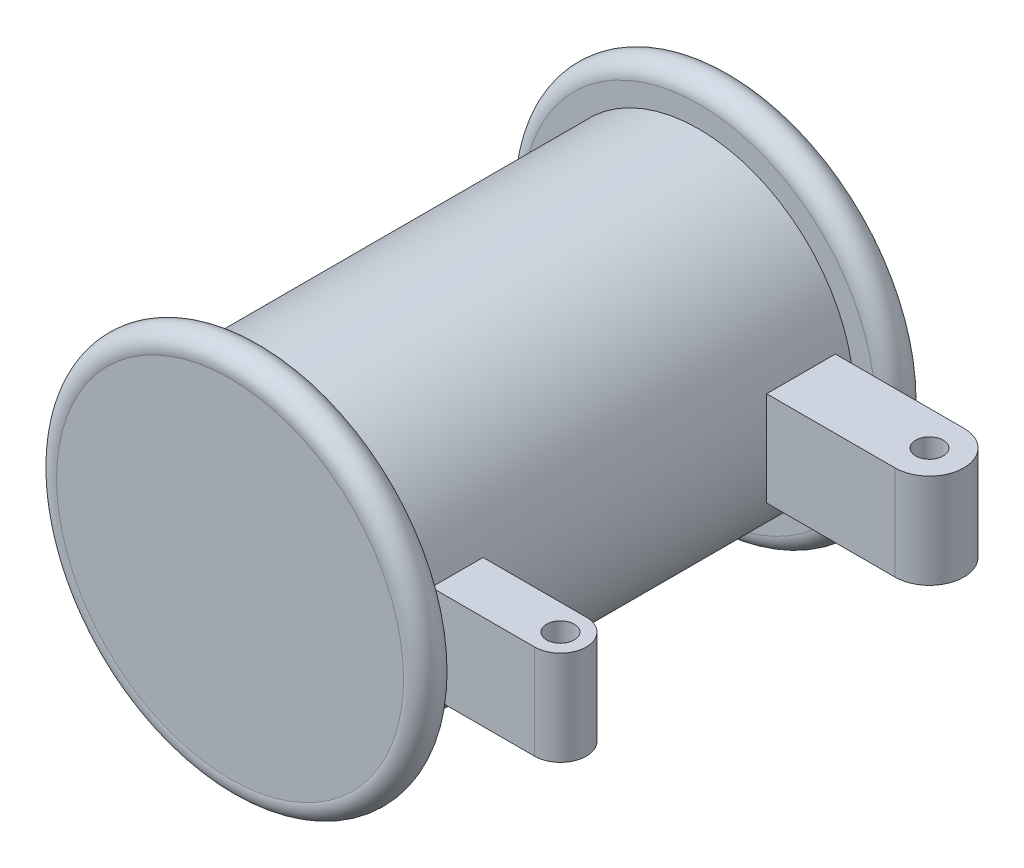
ISO-10303-21;
HEADER;
FILE_DESCRIPTION(('STEP AP214'),'2;1');
FILE_NAME('part.step','',(''),(''),'','','');
FILE_SCHEMA(('AUTOMOTIVE_DESIGN { 1 0 10303 214 1 1 1 1 }'));
ENDSEC;
DATA;
#1=APPLICATION_CONTEXT('core data for automotive mechanical design processes');
#2=APPLICATION_PROTOCOL_DEFINITION('international standard','automotive_design',2000,#1);
#3=PRODUCT_CONTEXT('',#1,'mechanical');
#4=PRODUCT('Part','Part','',(#3));
#5=PRODUCT_RELATED_PRODUCT_CATEGORY('part','',(#4));
#6=PRODUCT_DEFINITION_FORMATION('','',#4);
#7=PRODUCT_DEFINITION_CONTEXT('part definition',#1,'design');
#8=PRODUCT_DEFINITION('design','',#6,#7);
#9=PRODUCT_DEFINITION_SHAPE('','',#8);
#10=(LENGTH_UNIT() NAMED_UNIT(*) SI_UNIT(.MILLI.,.METRE.));
#11=(NAMED_UNIT(*) PLANE_ANGLE_UNIT() SI_UNIT($,.RADIAN.));
#12=(NAMED_UNIT(*) SI_UNIT($,.STERADIAN.) SOLID_ANGLE_UNIT());
#13=UNCERTAINTY_MEASURE_WITH_UNIT(LENGTH_MEASURE(1.E-05),#10,'distance_accuracy_value','');
#14=(GEOMETRIC_REPRESENTATION_CONTEXT(3) GLOBAL_UNCERTAINTY_ASSIGNED_CONTEXT((#13)) GLOBAL_UNIT_ASSIGNED_CONTEXT((#10,
#11,#12)) REPRESENTATION_CONTEXT('',''));
#15=CARTESIAN_POINT('',(0.,0.,0.));
#16=DIRECTION('',(0.,0.,1.));
#17=DIRECTION('',(1.,0.,0.));
#18=AXIS2_PLACEMENT_3D('',#15,#16,#17);
#19=CARTESIAN_POINT('',(5.313,0.344,-3.022));
#20=DIRECTION('',(0.,-1.,0.));
#21=DIRECTION('',(0.,0.,-1.));
#22=AXIS2_PLACEMENT_3D('',#19,#20,#21);
#23=CYLINDRICAL_SURFACE('',#22,0.25);
#24=CARTESIAN_POINT('',(5.313,-0.344,-3.022));
#25=DIRECTION('',(0.,1.,0.));
#26=DIRECTION('',(0.,0.,1.));
#27=AXIS2_PLACEMENT_3D('',#24,#25,#26);
#28=CIRCLE('',#27,0.25);
#29=CARTESIAN_POINT('',(5.313,-0.344,-3.272));
#30=VERTEX_POINT('',#29);
#31=CARTESIAN_POINT('',(5.313,-0.344,-2.772));
#32=VERTEX_POINT('',#31);
#33=EDGE_CURVE('E125',#30,#32,#28,.F.);
#34=ORIENTED_EDGE('',*,*,#33,.F.);
#35=DIRECTION('',(0.,-1.,0.));
#36=VECTOR('',#35,1.);
#37=CARTESIAN_POINT('',(5.313,0.344,-3.272));
#38=LINE('',#37,#36);
#39=CARTESIAN_POINT('',(5.313,0.344,-3.272));
#40=VERTEX_POINT('',#39);
#41=EDGE_CURVE('E12',#40,#30,#38,.T.);
#42=ORIENTED_EDGE('',*,*,#41,.F.);
#43=CARTESIAN_POINT('',(5.313,0.344,-3.022));
#44=DIRECTION('',(0.,1.,0.));
#45=DIRECTION('',(0.,0.,1.));
#46=AXIS2_PLACEMENT_3D('',#43,#44,#45);
#47=CIRCLE('',#46,0.25);
#48=CARTESIAN_POINT('',(5.313,0.344,-2.772));
#49=VERTEX_POINT('',#48);
#50=EDGE_CURVE('E115',#40,#49,#47,.F.);
#51=ORIENTED_EDGE('',*,*,#50,.T.);
#52=DIRECTION('',(0.,-1.,0.));
#53=VECTOR('',#52,1.);
#54=CARTESIAN_POINT('',(5.313,0.344,-2.772));
#55=LINE('',#54,#53);
#56=EDGE_CURVE('E73',#49,#32,#55,.T.);
#57=ORIENTED_EDGE('',*,*,#56,.T.);
#58=EDGE_LOOP('',(#34,#42,#51,#57));
#59=FACE_BOUND('',#58,.T.);
#60=ADVANCED_FACE('F56',(#59),#23,.T.);
#61=CARTESIAN_POINT('',(0.,0.344,-3.27199999999999));
#62=DIRECTION('',(0.,0.,-1.));
#63=DIRECTION('',(-1.,0.,0.));
#64=AXIS2_PLACEMENT_3D('',#61,#62,#63);
#65=PLANE('',#64);
#66=DIRECTION('',(1.,0.,0.));
#67=VECTOR('',#66,1.);
#68=CARTESIAN_POINT('',(0.,-0.344,-3.27199999999999));
#69=LINE('',#68,#67);
#70=CARTESIAN_POINT('',(4.379,-0.344,-3.272));
#71=VERTEX_POINT('',#70);
#72=EDGE_CURVE('E105',#71,#30,#69,.T.);
#73=ORIENTED_EDGE('',*,*,#72,.F.);
#74=DIRECTION('',(0.,-1.,0.));
#75=VECTOR('',#74,1.);
#76=CARTESIAN_POINT('',(4.379,0.344,-3.272));
#77=LINE('',#76,#75);
#78=CARTESIAN_POINT('',(4.379,0.344,-3.272));
#79=VERTEX_POINT('',#78);
#80=EDGE_CURVE('E65',#79,#71,#77,.T.);
#81=ORIENTED_EDGE('',*,*,#80,.F.);
#82=DIRECTION('',(1.,0.,0.));
#83=VECTOR('',#82,1.);
#84=CARTESIAN_POINT('',(0.,0.344,-3.27199999999999));
#85=LINE('',#84,#83);
#86=EDGE_CURVE('E103',#79,#40,#85,.T.);
#87=ORIENTED_EDGE('',*,*,#86,.T.);
#88=ORIENTED_EDGE('',*,*,#41,.T.);
#89=EDGE_LOOP('',(#73,#81,#87,#88));
#90=FACE_BOUND('',#89,.T.);
#91=ADVANCED_FACE('F101',(#90),#65,.T.);
#92=CARTESIAN_POINT('',(4.379,0.344,0.));
#93=DIRECTION('',(1.,0.,0.));
#94=DIRECTION('',(0.,0.,-1.));
#95=AXIS2_PLACEMENT_3D('',#92,#93,#94);
#96=PLANE('',#95);
#97=DIRECTION('',(0.,0.,1.));
#98=VECTOR('',#97,1.);
#99=CARTESIAN_POINT('',(4.379,-0.344,0.));
#100=LINE('',#99,#98);
#101=CARTESIAN_POINT('',(4.379,-0.344,-2.772));
#102=VERTEX_POINT('',#101);
#103=EDGE_CURVE('E128',#71,#102,#100,.T.);
#104=ORIENTED_EDGE('',*,*,#103,.T.);
#105=DIRECTION('',(0.,-1.,0.));
#106=VECTOR('',#105,1.);
#107=CARTESIAN_POINT('',(4.379,0.344,-2.772));
#108=LINE('',#107,#106);
#109=CARTESIAN_POINT('',(4.379,0.344,-2.772));
#110=VERTEX_POINT('',#109);
#111=EDGE_CURVE('E87',#110,#102,#108,.T.);
#112=ORIENTED_EDGE('',*,*,#111,.F.);
#113=DIRECTION('',(0.,0.,1.));
#114=VECTOR('',#113,1.);
#115=CARTESIAN_POINT('',(4.379,0.344,0.));
#116=LINE('',#115,#114);
#117=EDGE_CURVE('E108',#79,#110,#116,.T.);
#118=ORIENTED_EDGE('',*,*,#117,.F.);
#119=ORIENTED_EDGE('',*,*,#80,.T.);
#120=EDGE_LOOP('',(#104,#112,#118,#119));
#121=FACE_BOUND('',#120,.T.);
#122=ADVANCED_FACE('F109',(#121),#96,.F.);
#123=CARTESIAN_POINT('',(5.313,0.344,-3.022));
#124=DIRECTION('',(0.,-1.,0.));
#125=DIRECTION('',(0.,0.,-1.));
#126=AXIS2_PLACEMENT_3D('',#123,#124,#125);
#127=CYLINDRICAL_SURFACE('',#126,0.1);
#128=CARTESIAN_POINT('',(5.313,0.344,-3.022));
#129=DIRECTION('',(0.,1.,0.));
#130=DIRECTION('',(0.,0.,1.));
#131=AXIS2_PLACEMENT_3D('',#128,#129,#130);
#132=CIRCLE('',#131,0.1);
#133=CARTESIAN_POINT('',(5.313,0.344,-2.922));
#134=VERTEX_POINT('',#133);
#135=EDGE_CURVE('E117',#134,#134,#132,.T.);
#136=ORIENTED_EDGE('',*,*,#135,.T.);
#137=EDGE_LOOP('',(#136));
#138=FACE_BOUND('',#137,.T.);
#139=CARTESIAN_POINT('',(5.313,-0.344,-3.022));
#140=DIRECTION('',(0.,1.,0.));
#141=DIRECTION('',(0.,0.,1.));
#142=AXIS2_PLACEMENT_3D('',#139,#140,#141);
#143=CIRCLE('',#142,0.1);
#144=CARTESIAN_POINT('',(5.313,-0.344,-2.922));
#145=VERTEX_POINT('',#144);
#146=EDGE_CURVE('E122',#145,#145,#143,.T.);
#147=ORIENTED_EDGE('',*,*,#146,.F.);
#148=EDGE_LOOP('',(#147));
#149=FACE_BOUND('',#148,.T.);
#150=ADVANCED_FACE('F58',(#138,#149),#127,.F.);
#151=CARTESIAN_POINT('',(0.,0.344,-2.77199999999999));
#152=DIRECTION('',(0.,0.,1.));
#153=DIRECTION('',(1.,0.,0.));
#154=AXIS2_PLACEMENT_3D('',#151,#152,#153);
#155=PLANE('',#154);
#156=DIRECTION('',(-1.,0.,0.));
#157=VECTOR('',#156,1.);
#158=CARTESIAN_POINT('',(0.,-0.344,-2.77199999999999));
#159=LINE('',#158,#157);
#160=EDGE_CURVE('E130',#32,#102,#159,.T.);
#161=ORIENTED_EDGE('',*,*,#160,.F.);
#162=ORIENTED_EDGE('',*,*,#56,.F.);
#163=DIRECTION('',(-1.,0.,0.));
#164=VECTOR('',#163,1.);
#165=CARTESIAN_POINT('',(0.,0.344,-2.77199999999999));
#166=LINE('',#165,#164);
#167=EDGE_CURVE('E112',#49,#110,#166,.T.);
#168=ORIENTED_EDGE('',*,*,#167,.T.);
#169=ORIENTED_EDGE('',*,*,#111,.T.);
#170=EDGE_LOOP('',(#161,#162,#168,#169));
#171=FACE_BOUND('',#170,.T.);
#172=ADVANCED_FACE('F142',(#171),#155,.T.);
#173=CARTESIAN_POINT('',(0.,0.344,0.));
#174=DIRECTION('',(0.,1.,0.));
#175=DIRECTION('',(0.,0.,1.));
#176=AXIS2_PLACEMENT_3D('',#173,#174,#175);
#177=PLANE('',#176);
#178=ORIENTED_EDGE('',*,*,#135,.F.);
#179=EDGE_LOOP('',(#178));
#180=FACE_BOUND('',#179,.T.);
#181=ORIENTED_EDGE('',*,*,#50,.F.);
#182=ORIENTED_EDGE('',*,*,#86,.F.);
#183=ORIENTED_EDGE('',*,*,#117,.T.);
#184=ORIENTED_EDGE('',*,*,#167,.F.);
#185=EDGE_LOOP('',(#181,#182,#183,#184));
#186=FACE_BOUND('',#185,.T.);
#187=ADVANCED_FACE('F114',(#180,#186),#177,.T.);
#188=CARTESIAN_POINT('',(0.,-0.344,0.));
#189=DIRECTION('',(0.,1.,0.));
#190=DIRECTION('',(0.,0.,1.));
#191=AXIS2_PLACEMENT_3D('',#188,#189,#190);
#192=PLANE('',#191);
#193=ORIENTED_EDGE('',*,*,#146,.T.);
#194=EDGE_LOOP('',(#193));
#195=FACE_BOUND('',#194,.T.);
#196=ORIENTED_EDGE('',*,*,#33,.T.);
#197=ORIENTED_EDGE('',*,*,#160,.T.);
#198=ORIENTED_EDGE('',*,*,#103,.F.);
#199=ORIENTED_EDGE('',*,*,#72,.T.);
#200=EDGE_LOOP('',(#196,#197,#198,#199));
#201=FACE_BOUND('',#200,.T.);
#202=ADVANCED_FACE('F141',(#195,#201),#192,.F.);
#203=CLOSED_SHELL('',(#60,#91,#122,#150,#172,#187,#202));
#204=MANIFOLD_SOLID_BREP('B2',#203);
#205=CARTESIAN_POINT('',(5.13,0.344,-0.522000000000002));
#206=DIRECTION('',(0.,-1.,0.));
#207=DIRECTION('',(0.,0.,-1.));
#208=AXIS2_PLACEMENT_3D('',#205,#206,#207);
#209=CYLINDRICAL_SURFACE('',#208,0.188);
#210=CARTESIAN_POINT('',(5.13,-0.344,-0.522000000000002));
#211=DIRECTION('',(0.,1.,0.));
#212=DIRECTION('',(0.,0.,1.));
#213=AXIS2_PLACEMENT_3D('',#210,#211,#212);
#214=CIRCLE('',#213,0.188);
#215=CARTESIAN_POINT('',(5.13,-0.344,-0.710000000000002));
#216=VERTEX_POINT('',#215);
#217=CARTESIAN_POINT('',(5.13,-0.344,-0.334000000000002));
#218=VERTEX_POINT('',#217);
#219=EDGE_CURVE('E279',#216,#218,#214,.F.);
#220=ORIENTED_EDGE('',*,*,#219,.F.);
#221=DIRECTION('',(0.,-1.,0.));
#222=VECTOR('',#221,1.);
#223=CARTESIAN_POINT('',(5.13,0.344,-0.710000000000002));
#224=LINE('',#223,#222);
#225=CARTESIAN_POINT('',(5.13,0.344,-0.710000000000002));
#226=VERTEX_POINT('',#225);
#227=EDGE_CURVE('E54',#226,#216,#224,.T.);
#228=ORIENTED_EDGE('',*,*,#227,.F.);
#229=CARTESIAN_POINT('',(5.13,0.344,-0.522000000000002));
#230=DIRECTION('',(0.,1.,0.));
#231=DIRECTION('',(0.,0.,1.));
#232=AXIS2_PLACEMENT_3D('',#229,#230,#231);
#233=CIRCLE('',#232,0.188);
#234=CARTESIAN_POINT('',(5.13,0.344,-0.334000000000002));
#235=VERTEX_POINT('',#234);
#236=EDGE_CURVE('E269',#226,#235,#233,.F.);
#237=ORIENTED_EDGE('',*,*,#236,.T.);
#238=DIRECTION('',(0.,-1.,0.));
#239=VECTOR('',#238,1.);
#240=CARTESIAN_POINT('',(5.13,0.344,-0.334000000000002));
#241=LINE('',#240,#239);
#242=EDGE_CURVE('E227',#235,#218,#241,.T.);
#243=ORIENTED_EDGE('',*,*,#242,.T.);
#244=EDGE_LOOP('',(#220,#228,#237,#243));
#245=FACE_BOUND('',#244,.T.);
#246=ADVANCED_FACE('F210',(#245),#209,.T.);
#247=CARTESIAN_POINT('',(0.,0.344,-0.710000000000001));
#248=DIRECTION('',(0.,0.,-1.));
#249=DIRECTION('',(-1.,0.,0.));
#250=AXIS2_PLACEMENT_3D('',#247,#248,#249);
#251=PLANE('',#250);
#252=DIRECTION('',(1.,0.,0.));
#253=VECTOR('',#252,1.);
#254=CARTESIAN_POINT('',(0.,-0.344,-0.710000000000001));
#255=LINE('',#254,#253);
#256=CARTESIAN_POINT('',(4.379,-0.344,-0.710000000000002));
#257=VERTEX_POINT('',#256);
#258=EDGE_CURVE('E259',#257,#216,#255,.T.);
#259=ORIENTED_EDGE('',*,*,#258,.F.);
#260=DIRECTION('',(0.,-1.,0.));
#261=VECTOR('',#260,1.);
#262=CARTESIAN_POINT('',(4.379,0.344,-0.710000000000002));
#263=LINE('',#262,#261);
#264=CARTESIAN_POINT('',(4.379,0.344,-0.710000000000002));
#265=VERTEX_POINT('',#264);
#266=EDGE_CURVE('E219',#265,#257,#263,.T.);
#267=ORIENTED_EDGE('',*,*,#266,.F.);
#268=DIRECTION('',(1.,0.,0.));
#269=VECTOR('',#268,1.);
#270=CARTESIAN_POINT('',(0.,0.344,-0.710000000000001));
#271=LINE('',#270,#269);
#272=EDGE_CURVE('E257',#265,#226,#271,.T.);
#273=ORIENTED_EDGE('',*,*,#272,.T.);
#274=ORIENTED_EDGE('',*,*,#227,.T.);
#275=EDGE_LOOP('',(#259,#267,#273,#274));
#276=FACE_BOUND('',#275,.T.);
#277=ADVANCED_FACE('F255',(#276),#251,.T.);
#278=CARTESIAN_POINT('',(4.379,0.344,0.));
#279=DIRECTION('',(1.,0.,0.));
#280=DIRECTION('',(0.,0.,-1.));
#281=AXIS2_PLACEMENT_3D('',#278,#279,#280);
#282=PLANE('',#281);
#283=DIRECTION('',(0.,0.,1.));
#284=VECTOR('',#283,1.);
#285=CARTESIAN_POINT('',(4.379,-0.344,0.));
#286=LINE('',#285,#284);
#287=CARTESIAN_POINT('',(4.379,-0.344,-0.334000000000002));
#288=VERTEX_POINT('',#287);
#289=EDGE_CURVE('E282',#257,#288,#286,.T.);
#290=ORIENTED_EDGE('',*,*,#289,.T.);
#291=DIRECTION('',(0.,-1.,0.));
#292=VECTOR('',#291,1.);
#293=CARTESIAN_POINT('',(4.379,0.344,-0.334000000000002));
#294=LINE('',#293,#292);
#295=CARTESIAN_POINT('',(4.379,0.344,-0.334000000000002));
#296=VERTEX_POINT('',#295);
#297=EDGE_CURVE('E241',#296,#288,#294,.T.);
#298=ORIENTED_EDGE('',*,*,#297,.F.);
#299=DIRECTION('',(0.,0.,1.));
#300=VECTOR('',#299,1.);
#301=CARTESIAN_POINT('',(4.379,0.344,0.));
#302=LINE('',#301,#300);
#303=EDGE_CURVE('E262',#265,#296,#302,.T.);
#304=ORIENTED_EDGE('',*,*,#303,.F.);
#305=ORIENTED_EDGE('',*,*,#266,.T.);
#306=EDGE_LOOP('',(#290,#298,#304,#305));
#307=FACE_BOUND('',#306,.T.);
#308=ADVANCED_FACE('F263',(#307),#282,.F.);
#309=CARTESIAN_POINT('',(5.13,0.344,-0.522000000000002));
#310=DIRECTION('',(0.,-1.,0.));
#311=DIRECTION('',(0.,0.,-1.));
#312=AXIS2_PLACEMENT_3D('',#309,#310,#311);
#313=CYLINDRICAL_SURFACE('',#312,0.1);
#314=CARTESIAN_POINT('',(5.13,0.344,-0.522000000000002));
#315=DIRECTION('',(0.,1.,0.));
#316=DIRECTION('',(0.,0.,1.));
#317=AXIS2_PLACEMENT_3D('',#314,#315,#316);
#318=CIRCLE('',#317,0.1);
#319=CARTESIAN_POINT('',(5.13,0.344,-0.422000000000002));
#320=VERTEX_POINT('',#319);
#321=EDGE_CURVE('E271',#320,#320,#318,.T.);
#322=ORIENTED_EDGE('',*,*,#321,.T.);
#323=EDGE_LOOP('',(#322));
#324=FACE_BOUND('',#323,.T.);
#325=CARTESIAN_POINT('',(5.13,-0.344,-0.522000000000002));
#326=DIRECTION('',(0.,1.,0.));
#327=DIRECTION('',(0.,0.,1.));
#328=AXIS2_PLACEMENT_3D('',#325,#326,#327);
#329=CIRCLE('',#328,0.1);
#330=CARTESIAN_POINT('',(5.13,-0.344,-0.422000000000002));
#331=VERTEX_POINT('',#330);
#332=EDGE_CURVE('E276',#331,#331,#329,.T.);
#333=ORIENTED_EDGE('',*,*,#332,.F.);
#334=EDGE_LOOP('',(#333));
#335=FACE_BOUND('',#334,.T.);
#336=ADVANCED_FACE('F212',(#324,#335),#313,.F.);
#337=CARTESIAN_POINT('',(0.,0.344,-0.334000000000001));
#338=DIRECTION('',(0.,0.,1.));
#339=DIRECTION('',(1.,0.,0.));
#340=AXIS2_PLACEMENT_3D('',#337,#338,#339);
#341=PLANE('',#340);
#342=DIRECTION('',(-1.,0.,0.));
#343=VECTOR('',#342,1.);
#344=CARTESIAN_POINT('',(0.,-0.344,-0.334000000000001));
#345=LINE('',#344,#343);
#346=EDGE_CURVE('E284',#218,#288,#345,.T.);
#347=ORIENTED_EDGE('',*,*,#346,.F.);
#348=ORIENTED_EDGE('',*,*,#242,.F.);
#349=DIRECTION('',(-1.,0.,0.));
#350=VECTOR('',#349,1.);
#351=CARTESIAN_POINT('',(0.,0.344,-0.334000000000001));
#352=LINE('',#351,#350);
#353=EDGE_CURVE('E266',#235,#296,#352,.T.);
#354=ORIENTED_EDGE('',*,*,#353,.T.);
#355=ORIENTED_EDGE('',*,*,#297,.T.);
#356=EDGE_LOOP('',(#347,#348,#354,#355));
#357=FACE_BOUND('',#356,.T.);
#358=ADVANCED_FACE('F296',(#357),#341,.T.);
#359=CARTESIAN_POINT('',(0.,0.344,0.));
#360=DIRECTION('',(0.,1.,0.));
#361=DIRECTION('',(0.,0.,1.));
#362=AXIS2_PLACEMENT_3D('',#359,#360,#361);
#363=PLANE('',#362);
#364=ORIENTED_EDGE('',*,*,#321,.F.);
#365=EDGE_LOOP('',(#364));
#366=FACE_BOUND('',#365,.T.);
#367=ORIENTED_EDGE('',*,*,#236,.F.);
#368=ORIENTED_EDGE('',*,*,#272,.F.);
#369=ORIENTED_EDGE('',*,*,#303,.T.);
#370=ORIENTED_EDGE('',*,*,#353,.F.);
#371=EDGE_LOOP('',(#367,#368,#369,#370));
#372=FACE_BOUND('',#371,.T.);
#373=ADVANCED_FACE('F268',(#366,#372),#363,.T.);
#374=CARTESIAN_POINT('',(0.,-0.344,0.));
#375=DIRECTION('',(0.,1.,0.));
#376=DIRECTION('',(0.,0.,1.));
#377=AXIS2_PLACEMENT_3D('',#374,#375,#376);
#378=PLANE('',#377);
#379=ORIENTED_EDGE('',*,*,#332,.T.);
#380=EDGE_LOOP('',(#379));
#381=FACE_BOUND('',#380,.T.);
#382=ORIENTED_EDGE('',*,*,#219,.T.);
#383=ORIENTED_EDGE('',*,*,#346,.T.);
#384=ORIENTED_EDGE('',*,*,#289,.F.);
#385=ORIENTED_EDGE('',*,*,#258,.T.);
#386=EDGE_LOOP('',(#382,#383,#384,#385));
#387=FACE_BOUND('',#386,.T.);
#388=ADVANCED_FACE('F295',(#381,#387),#378,.F.);
#389=CLOSED_SHELL('',(#246,#277,#308,#336,#358,#373,#388));
#390=MANIFOLD_SOLID_BREP('B6',#389);
#391=CARTESIAN_POINT('',(4.379,0.,-0.24154254995443));
#392=DIRECTION('',(0.,0.,1.));
#393=DIRECTION('',(1.,0.,0.));
#394=AXIS2_PLACEMENT_3D('',#391,#392,#393);
#395=PLANE('',#394);
#396=CARTESIAN_POINT('',(3.25,0.,-0.24154254995443));
#397=DIRECTION('',(0.,0.,1.));
#398=DIRECTION('',(1.,0.,0.));
#399=AXIS2_PLACEMENT_3D('',#396,#397,#398);
#400=CIRCLE('',#399,1.2856159172411);
#401=CARTESIAN_POINT('',(4.5356159172411,0.,-0.24154254995443));
#402=VERTEX_POINT('',#401);
#403=EDGE_CURVE('E209',#402,#402,#400,.T.);
#404=ORIENTED_EDGE('',*,*,#403,.F.);
#405=EDGE_LOOP('',(#404));
#406=FACE_BOUND('',#405,.T.);
#407=CARTESIAN_POINT('',(3.25,0.,-0.24154254995443));
#408=DIRECTION('',(0.,0.,1.));
#409=DIRECTION('',(1.,0.,0.));
#410=AXIS2_PLACEMENT_3D('',#407,#408,#409);
#411=CIRCLE('',#410,1.129);
#412=CARTESIAN_POINT('',(4.379,0.,-0.24154254995443));
#413=VERTEX_POINT('',#412);
#414=EDGE_CURVE('E383',#413,#413,#411,.T.);
#415=ORIENTED_EDGE('',*,*,#414,.T.);
#416=EDGE_LOOP('',(#415));
#417=FACE_BOUND('',#416,.T.);
#418=ADVANCED_FACE('F361',(#406,#417),#395,.F.);
#419=CARTESIAN_POINT('',(3.25,0.,-0.11954254995443));
#420=DIRECTION('',(0.,0.,1.));
#421=DIRECTION('',(1.,0.,0.));
#422=AXIS2_PLACEMENT_3D('',#419,#420,#421);
#423=TOROIDAL_SURFACE('',#422,1.2856159172411,0.122);
#424=CARTESIAN_POINT('',(3.25,0.,0.));
#425=DIRECTION('',(0.,0.,1.));
#426=DIRECTION('',(1.,0.,0.));
#427=AXIS2_PLACEMENT_3D('',#424,#425,#426);
#428=CIRCLE('',#427,1.26125244560029);
#429=CARTESIAN_POINT('',(4.51125244560029,0.,0.));
#430=VERTEX_POINT('',#429);
#431=EDGE_CURVE('E367',#430,#430,#428,.T.);
#432=ORIENTED_EDGE('',*,*,#431,.F.);
#433=EDGE_LOOP('',(#432));
#434=FACE_BOUND('',#433,.T.);
#435=ORIENTED_EDGE('',*,*,#403,.T.);
#436=EDGE_LOOP('',(#435));
#437=FACE_BOUND('',#436,.T.);
#438=ADVANCED_FACE('F413',(#434,#437),#423,.T.);
#439=CARTESIAN_POINT('',(3.25,0.,0.));
#440=DIRECTION('',(0.,0.,1.));
#441=DIRECTION('',(1.,0.,0.));
#442=AXIS2_PLACEMENT_3D('',#439,#440,#441);
#443=PLANE('',#442);
#444=ORIENTED_EDGE('',*,*,#431,.T.);
#445=EDGE_LOOP('',(#444));
#446=FACE_BOUND('',#445,.T.);
#447=ADVANCED_FACE('F408',(#446),#443,.T.);
#448=CARTESIAN_POINT('',(3.25,0.,-3.652));
#449=DIRECTION('',(0.,0.,1.));
#450=DIRECTION('',(1.,0.,0.));
#451=AXIS2_PLACEMENT_3D('',#448,#449,#450);
#452=PLANE('',#451);
#453=CARTESIAN_POINT('',(3.25,0.,-3.652));
#454=DIRECTION('',(0.,0.,1.));
#455=DIRECTION('',(1.,0.,0.));
#456=AXIS2_PLACEMENT_3D('',#453,#454,#455);
#457=CIRCLE('',#456,1.285);
#458=CARTESIAN_POINT('',(4.535,0.,-3.652));
#459=VERTEX_POINT('',#458);
#460=EDGE_CURVE('E371',#459,#459,#457,.T.);
#461=ORIENTED_EDGE('',*,*,#460,.F.);
#462=EDGE_LOOP('',(#461));
#463=FACE_BOUND('',#462,.T.);
#464=ADVANCED_FACE('F403',(#463),#452,.F.);
#465=CARTESIAN_POINT('',(3.25,0.,-3.53));
#466=DIRECTION('',(0.,0.,1.));
#467=DIRECTION('',(1.,0.,0.));
#468=AXIS2_PLACEMENT_3D('',#465,#466,#467);
#469=TOROIDAL_SURFACE('',#468,1.285,0.122);
#470=CARTESIAN_POINT('',(3.25,0.,-3.408));
#471=DIRECTION('',(0.,0.,1.));
#472=DIRECTION('',(1.,0.,0.));
#473=AXIS2_PLACEMENT_3D('',#470,#471,#472);
#474=CIRCLE('',#473,1.285);
#475=CARTESIAN_POINT('',(4.535,0.,-3.408));
#476=VERTEX_POINT('',#475);
#477=EDGE_CURVE('E375',#476,#476,#474,.T.);
#478=ORIENTED_EDGE('',*,*,#477,.F.);
#479=EDGE_LOOP('',(#478));
#480=FACE_BOUND('',#479,.T.);
#481=ORIENTED_EDGE('',*,*,#460,.T.);
#482=EDGE_LOOP('',(#481));
#483=FACE_BOUND('',#482,.T.);
#484=ADVANCED_FACE('F397',(#480,#483),#469,.T.);
#485=CARTESIAN_POINT('',(4.535,0.,-3.408));
#486=DIRECTION('',(0.,0.,-1.));
#487=DIRECTION('',(-1.,0.,0.));
#488=AXIS2_PLACEMENT_3D('',#485,#486,#487);
#489=PLANE('',#488);
#490=CARTESIAN_POINT('',(3.25,0.,-3.408));
#491=DIRECTION('',(0.,0.,1.));
#492=DIRECTION('',(1.,0.,0.));
#493=AXIS2_PLACEMENT_3D('',#490,#491,#492);
#494=CIRCLE('',#493,1.129);
#495=CARTESIAN_POINT('',(4.379,0.,-3.408));
#496=VERTEX_POINT('',#495);
#497=EDGE_CURVE('E380',#496,#496,#494,.T.);
#498=ORIENTED_EDGE('',*,*,#497,.F.);
#499=EDGE_LOOP('',(#498));
#500=FACE_BOUND('',#499,.T.);
#501=ORIENTED_EDGE('',*,*,#477,.T.);
#502=EDGE_LOOP('',(#501));
#503=FACE_BOUND('',#502,.T.);
#504=ADVANCED_FACE('F391',(#500,#503),#489,.F.);
#505=CARTESIAN_POINT('',(3.25,0.,0.));
#506=DIRECTION('',(0.,0.,1.));
#507=DIRECTION('',(1.,0.,0.));
#508=AXIS2_PLACEMENT_3D('',#505,#506,#507);
#509=CYLINDRICAL_SURFACE('',#508,1.129);
#510=ORIENTED_EDGE('',*,*,#414,.F.);
#511=EDGE_LOOP('',(#510));
#512=FACE_BOUND('',#511,.T.);
#513=ORIENTED_EDGE('',*,*,#497,.T.);
#514=EDGE_LOOP('',(#513));
#515=FACE_BOUND('',#514,.T.);
#516=ADVANCED_FACE('F388',(#512,#515),#509,.T.);
#517=CLOSED_SHELL('',(#418,#438,#447,#464,#484,#504,#516));
#518=MANIFOLD_SOLID_BREP('B48',#517);
#519=ADVANCED_BREP_SHAPE_REPRESENTATION('',(#18,#204,#390,#518),#14);
#520=SHAPE_DEFINITION_REPRESENTATION(#9,#519);
ENDSEC;
END-ISO-10303-21;
